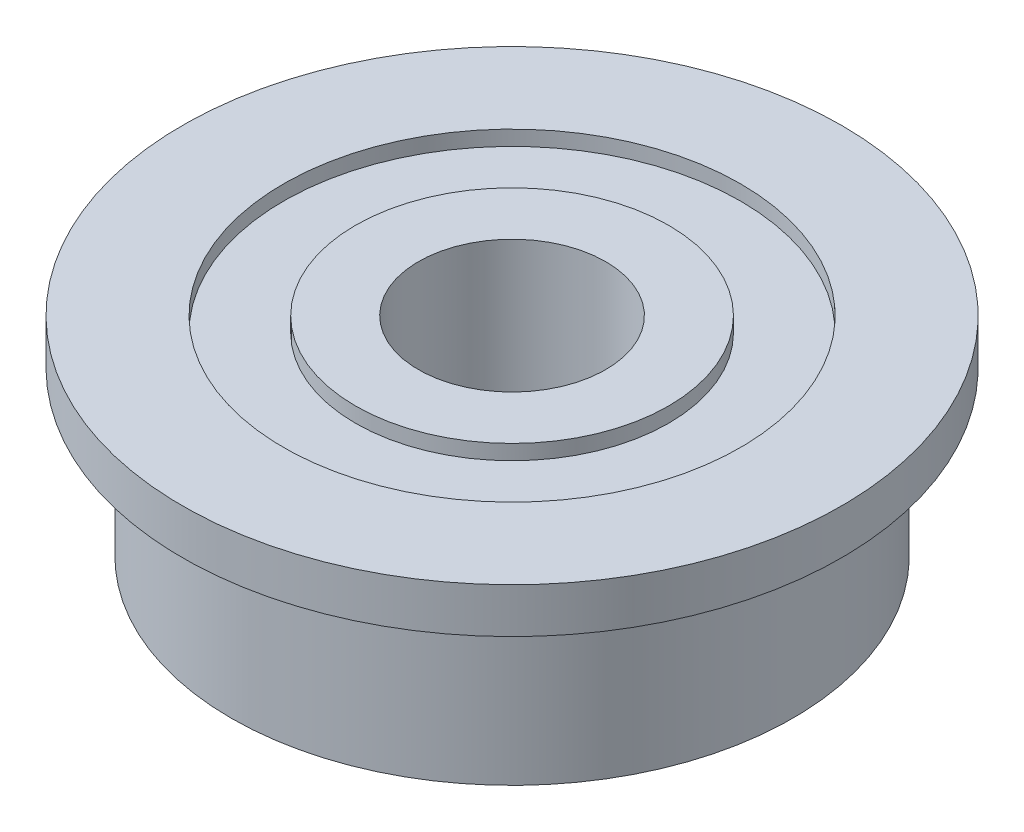
ISO-10303-21;
HEADER;
FILE_DESCRIPTION(('STEP AP214'),'2;1');
FILE_NAME('part.step','',(''),(''),'','','');
FILE_SCHEMA(('AUTOMOTIVE_DESIGN { 1 0 10303 214 1 1 1 1 }'));
ENDSEC;
DATA;
#1=APPLICATION_CONTEXT('core data for automotive mechanical design processes');
#2=APPLICATION_PROTOCOL_DEFINITION('international standard','automotive_design',2000,#1);
#3=PRODUCT_CONTEXT('',#1,'mechanical');
#4=PRODUCT('Part','Part','',(#3));
#5=PRODUCT_RELATED_PRODUCT_CATEGORY('part','',(#4));
#6=PRODUCT_DEFINITION_FORMATION('','',#4);
#7=PRODUCT_DEFINITION_CONTEXT('part definition',#1,'design');
#8=PRODUCT_DEFINITION('design','',#6,#7);
#9=PRODUCT_DEFINITION_SHAPE('','',#8);
#10=(LENGTH_UNIT() NAMED_UNIT(*) SI_UNIT(.MILLI.,.METRE.));
#11=(NAMED_UNIT(*) PLANE_ANGLE_UNIT() SI_UNIT($,.RADIAN.));
#12=(NAMED_UNIT(*) SI_UNIT($,.STERADIAN.) SOLID_ANGLE_UNIT());
#13=UNCERTAINTY_MEASURE_WITH_UNIT(LENGTH_MEASURE(1.E-05),#10,'distance_accuracy_value','');
#14=(GEOMETRIC_REPRESENTATION_CONTEXT(3) GLOBAL_UNCERTAINTY_ASSIGNED_CONTEXT((#13)) GLOBAL_UNIT_ASSIGNED_CONTEXT((#10,
#11,#12)) REPRESENTATION_CONTEXT('',''));
#15=CARTESIAN_POINT('',(0.,0.,0.));
#16=DIRECTION('',(0.,0.,1.));
#17=DIRECTION('',(1.,0.,0.));
#18=AXIS2_PLACEMENT_3D('',#15,#16,#17);
#19=CARTESIAN_POINT('',(1.5875,0.,0.));
#20=DIRECTION('',(0.,-1.,0.));
#21=DIRECTION('',(0.,0.,-1.));
#22=AXIS2_PLACEMENT_3D('',#19,#20,#21);
#23=PLANE('',#22);
#24=CARTESIAN_POINT('',(0.,0.,0.));
#25=DIRECTION('',(0.,-1.,0.));
#26=DIRECTION('',(0.,0.,-1.));
#27=AXIS2_PLACEMENT_3D('',#24,#25,#26);
#28=CIRCLE('',#27,2.6543);
#29=CARTESIAN_POINT('',(0.,0.,-2.6543));
#30=VERTEX_POINT('',#29);
#31=EDGE_CURVE('E10',#30,#30,#28,.T.);
#32=ORIENTED_EDGE('',*,*,#31,.T.);
#33=EDGE_LOOP('',(#32));
#34=FACE_BOUND('',#33,.T.);
#35=CARTESIAN_POINT('',(0.,0.,0.));
#36=DIRECTION('',(0.,-1.,0.));
#37=DIRECTION('',(0.,0.,-1.));
#38=AXIS2_PLACEMENT_3D('',#35,#36,#37);
#39=CIRCLE('',#38,1.5875);
#40=CARTESIAN_POINT('',(0.,0.,-1.5875));
#41=VERTEX_POINT('',#40);
#42=EDGE_CURVE('E76',#41,#41,#39,.T.);
#43=ORIENTED_EDGE('',*,*,#42,.F.);
#44=EDGE_LOOP('',(#43));
#45=FACE_BOUND('',#44,.T.);
#46=ADVANCED_FACE('F30',(#34,#45),#23,.T.);
#47=CARTESIAN_POINT('',(0.,3.5306,0.));
#48=DIRECTION('',(0.,-1.,0.));
#49=DIRECTION('',(0.,0.,-1.));
#50=AXIS2_PLACEMENT_3D('',#47,#48,#49);
#51=CYLINDRICAL_SURFACE('',#50,2.6543);
#52=CARTESIAN_POINT('',(0.,0.254,0.));
#53=DIRECTION('',(0.,-1.,0.));
#54=DIRECTION('',(0.,0.,-1.));
#55=AXIS2_PLACEMENT_3D('',#52,#53,#54);
#56=CIRCLE('',#55,2.6543);
#57=CARTESIAN_POINT('',(0.,0.254,-2.6543));
#58=VERTEX_POINT('',#57);
#59=EDGE_CURVE('E36',#58,#58,#56,.T.);
#60=ORIENTED_EDGE('',*,*,#59,.T.);
#61=EDGE_LOOP('',(#60));
#62=FACE_BOUND('',#61,.T.);
#63=ORIENTED_EDGE('',*,*,#31,.F.);
#64=EDGE_LOOP('',(#63));
#65=FACE_BOUND('',#64,.T.);
#66=ADVANCED_FACE('F84',(#62,#65),#51,.T.);
#67=CARTESIAN_POINT('',(2.6543,0.254,0.));
#68=DIRECTION('',(0.,-1.,0.));
#69=DIRECTION('',(0.,0.,-1.));
#70=AXIS2_PLACEMENT_3D('',#67,#68,#69);
#71=PLANE('',#70);
#72=CARTESIAN_POINT('',(0.,0.254,0.));
#73=DIRECTION('',(0.,-1.,0.));
#74=DIRECTION('',(0.,0.,-1.));
#75=AXIS2_PLACEMENT_3D('',#72,#73,#74);
#76=CIRCLE('',#75,3.8735);
#77=CARTESIAN_POINT('',(0.,0.254,-3.8735));
#78=VERTEX_POINT('',#77);
#79=EDGE_CURVE('E40',#78,#78,#76,.T.);
#80=ORIENTED_EDGE('',*,*,#79,.T.);
#81=EDGE_LOOP('',(#80));
#82=FACE_BOUND('',#81,.T.);
#83=ORIENTED_EDGE('',*,*,#59,.F.);
#84=EDGE_LOOP('',(#83));
#85=FACE_BOUND('',#84,.T.);
#86=ADVANCED_FACE('F88',(#82,#85),#71,.T.);
#87=CARTESIAN_POINT('',(0.,3.5306,0.));
#88=DIRECTION('',(0.,-1.,0.));
#89=DIRECTION('',(0.,0.,-1.));
#90=AXIS2_PLACEMENT_3D('',#87,#88,#89);
#91=CYLINDRICAL_SURFACE('',#90,3.8735);
#92=CARTESIAN_POINT('',(0.,0.,0.));
#93=DIRECTION('',(0.,-1.,0.));
#94=DIRECTION('',(0.,0.,-1.));
#95=AXIS2_PLACEMENT_3D('',#92,#93,#94);
#96=CIRCLE('',#95,3.8735);
#97=CARTESIAN_POINT('',(0.,0.,-3.8735));
#98=VERTEX_POINT('',#97);
#99=EDGE_CURVE('E44',#98,#98,#96,.T.);
#100=ORIENTED_EDGE('',*,*,#99,.T.);
#101=EDGE_LOOP('',(#100));
#102=FACE_BOUND('',#101,.T.);
#103=ORIENTED_EDGE('',*,*,#79,.F.);
#104=EDGE_LOOP('',(#103));
#105=FACE_BOUND('',#104,.T.);
#106=ADVANCED_FACE('F92',(#102,#105),#91,.F.);
#107=CARTESIAN_POINT('',(3.8735,0.,0.));
#108=DIRECTION('',(0.,-1.,0.));
#109=DIRECTION('',(0.,0.,-1.));
#110=AXIS2_PLACEMENT_3D('',#107,#108,#109);
#111=PLANE('',#110);
#112=CARTESIAN_POINT('',(0.,0.,0.));
#113=DIRECTION('',(0.,-1.,0.));
#114=DIRECTION('',(0.,0.,-1.));
#115=AXIS2_PLACEMENT_3D('',#112,#113,#114);
#116=CIRCLE('',#115,4.7625);
#117=CARTESIAN_POINT('',(0.,0.,-4.7625));
#118=VERTEX_POINT('',#117);
#119=EDGE_CURVE('E49',#118,#118,#116,.T.);
#120=ORIENTED_EDGE('',*,*,#119,.T.);
#121=EDGE_LOOP('',(#120));
#122=FACE_BOUND('',#121,.T.);
#123=ORIENTED_EDGE('',*,*,#99,.F.);
#124=EDGE_LOOP('',(#123));
#125=FACE_BOUND('',#124,.T.);
#126=ADVANCED_FACE('F99',(#122,#125),#111,.T.);
#127=CARTESIAN_POINT('',(0.,3.5306,0.));
#128=DIRECTION('',(0.,-1.,0.));
#129=DIRECTION('',(0.,0.,-1.));
#130=AXIS2_PLACEMENT_3D('',#127,#128,#129);
#131=CYLINDRICAL_SURFACE('',#130,4.7625);
#132=CARTESIAN_POINT('',(0.,2.7686,0.));
#133=DIRECTION('',(0.,-1.,0.));
#134=DIRECTION('',(0.,0.,-1.));
#135=AXIS2_PLACEMENT_3D('',#132,#133,#134);
#136=CIRCLE('',#135,4.7625);
#137=CARTESIAN_POINT('',(0.,2.7686,-4.7625));
#138=VERTEX_POINT('',#137);
#139=EDGE_CURVE('E52',#138,#138,#136,.T.);
#140=ORIENTED_EDGE('',*,*,#139,.T.);
#141=EDGE_LOOP('',(#140));
#142=FACE_BOUND('',#141,.T.);
#143=ORIENTED_EDGE('',*,*,#119,.F.);
#144=EDGE_LOOP('',(#143));
#145=FACE_BOUND('',#144,.T.);
#146=ADVANCED_FACE('F103',(#142,#145),#131,.T.);
#147=CARTESIAN_POINT('',(4.7625,2.7686,0.));
#148=DIRECTION('',(0.,-1.,0.));
#149=DIRECTION('',(0.,0.,-1.));
#150=AXIS2_PLACEMENT_3D('',#147,#148,#149);
#151=PLANE('',#150);
#152=CARTESIAN_POINT('',(0.,2.7686,0.));
#153=DIRECTION('',(0.,-1.,0.));
#154=DIRECTION('',(0.,0.,-1.));
#155=AXIS2_PLACEMENT_3D('',#152,#153,#154);
#156=CIRCLE('',#155,5.588);
#157=CARTESIAN_POINT('',(0.,2.7686,-5.588));
#158=VERTEX_POINT('',#157);
#159=EDGE_CURVE('E55',#158,#158,#156,.T.);
#160=ORIENTED_EDGE('',*,*,#159,.T.);
#161=EDGE_LOOP('',(#160));
#162=FACE_BOUND('',#161,.T.);
#163=ORIENTED_EDGE('',*,*,#139,.F.);
#164=EDGE_LOOP('',(#163));
#165=FACE_BOUND('',#164,.T.);
#166=ADVANCED_FACE('F107',(#162,#165),#151,.T.);
#167=CARTESIAN_POINT('',(0.,3.5306,0.));
#168=DIRECTION('',(0.,-1.,0.));
#169=DIRECTION('',(0.,0.,-1.));
#170=AXIS2_PLACEMENT_3D('',#167,#168,#169);
#171=CYLINDRICAL_SURFACE('',#170,5.588);
#172=CARTESIAN_POINT('',(0.,3.5306,0.));
#173=DIRECTION('',(0.,-1.,0.));
#174=DIRECTION('',(0.,0.,-1.));
#175=AXIS2_PLACEMENT_3D('',#172,#173,#174);
#176=CIRCLE('',#175,5.588);
#177=CARTESIAN_POINT('',(0.,3.5306,-5.588));
#178=VERTEX_POINT('',#177);
#179=EDGE_CURVE('E58',#178,#178,#176,.T.);
#180=ORIENTED_EDGE('',*,*,#179,.T.);
#181=EDGE_LOOP('',(#180));
#182=FACE_BOUND('',#181,.T.);
#183=ORIENTED_EDGE('',*,*,#159,.F.);
#184=EDGE_LOOP('',(#183));
#185=FACE_BOUND('',#184,.T.);
#186=ADVANCED_FACE('F111',(#182,#185),#171,.T.);
#187=CARTESIAN_POINT('',(5.588,3.5306,0.));
#188=DIRECTION('',(0.,1.,0.));
#189=DIRECTION('',(0.,0.,1.));
#190=AXIS2_PLACEMENT_3D('',#187,#188,#189);
#191=PLANE('',#190);
#192=CARTESIAN_POINT('',(0.,3.5306,0.));
#193=DIRECTION('',(0.,-1.,0.));
#194=DIRECTION('',(0.,0.,-1.));
#195=AXIS2_PLACEMENT_3D('',#192,#193,#194);
#196=CIRCLE('',#195,3.8735);
#197=CARTESIAN_POINT('',(0.,3.5306,-3.8735));
#198=VERTEX_POINT('',#197);
#199=EDGE_CURVE('E61',#198,#198,#196,.T.);
#200=ORIENTED_EDGE('',*,*,#199,.T.);
#201=EDGE_LOOP('',(#200));
#202=FACE_BOUND('',#201,.T.);
#203=ORIENTED_EDGE('',*,*,#179,.F.);
#204=EDGE_LOOP('',(#203));
#205=FACE_BOUND('',#204,.T.);
#206=ADVANCED_FACE('F115',(#202,#205),#191,.T.);
#207=CARTESIAN_POINT('',(0.,3.5306,0.));
#208=DIRECTION('',(0.,-1.,0.));
#209=DIRECTION('',(0.,0.,-1.));
#210=AXIS2_PLACEMENT_3D('',#207,#208,#209);
#211=CYLINDRICAL_SURFACE('',#210,3.8735);
#212=CARTESIAN_POINT('',(0.,3.2766,0.));
#213=DIRECTION('',(0.,-1.,0.));
#214=DIRECTION('',(0.,0.,-1.));
#215=AXIS2_PLACEMENT_3D('',#212,#213,#214);
#216=CIRCLE('',#215,3.8735);
#217=CARTESIAN_POINT('',(0.,3.2766,-3.8735));
#218=VERTEX_POINT('',#217);
#219=EDGE_CURVE('E64',#218,#218,#216,.T.);
#220=ORIENTED_EDGE('',*,*,#219,.T.);
#221=EDGE_LOOP('',(#220));
#222=FACE_BOUND('',#221,.T.);
#223=ORIENTED_EDGE('',*,*,#199,.F.);
#224=EDGE_LOOP('',(#223));
#225=FACE_BOUND('',#224,.T.);
#226=ADVANCED_FACE('F119',(#222,#225),#211,.F.);
#227=CARTESIAN_POINT('',(3.8735,3.2766,0.));
#228=DIRECTION('',(0.,1.,0.));
#229=DIRECTION('',(0.,0.,1.));
#230=AXIS2_PLACEMENT_3D('',#227,#228,#229);
#231=PLANE('',#230);
#232=CARTESIAN_POINT('',(0.,3.2766,0.));
#233=DIRECTION('',(0.,-1.,0.));
#234=DIRECTION('',(0.,0.,-1.));
#235=AXIS2_PLACEMENT_3D('',#232,#233,#234);
#236=CIRCLE('',#235,2.6543);
#237=CARTESIAN_POINT('',(0.,3.2766,-2.6543));
#238=VERTEX_POINT('',#237);
#239=EDGE_CURVE('E67',#238,#238,#236,.T.);
#240=ORIENTED_EDGE('',*,*,#239,.T.);
#241=EDGE_LOOP('',(#240));
#242=FACE_BOUND('',#241,.T.);
#243=ORIENTED_EDGE('',*,*,#219,.F.);
#244=EDGE_LOOP('',(#243));
#245=FACE_BOUND('',#244,.T.);
#246=ADVANCED_FACE('F123',(#242,#245),#231,.T.);
#247=CARTESIAN_POINT('',(0.,3.5306,0.));
#248=DIRECTION('',(0.,-1.,0.));
#249=DIRECTION('',(0.,0.,-1.));
#250=AXIS2_PLACEMENT_3D('',#247,#248,#249);
#251=CYLINDRICAL_SURFACE('',#250,2.6543);
#252=CARTESIAN_POINT('',(0.,3.5306,0.));
#253=DIRECTION('',(0.,-1.,0.));
#254=DIRECTION('',(0.,0.,-1.));
#255=AXIS2_PLACEMENT_3D('',#252,#253,#254);
#256=CIRCLE('',#255,2.6543);
#257=CARTESIAN_POINT('',(0.,3.5306,-2.6543));
#258=VERTEX_POINT('',#257);
#259=EDGE_CURVE('E70',#258,#258,#256,.T.);
#260=ORIENTED_EDGE('',*,*,#259,.T.);
#261=EDGE_LOOP('',(#260));
#262=FACE_BOUND('',#261,.T.);
#263=ORIENTED_EDGE('',*,*,#239,.F.);
#264=EDGE_LOOP('',(#263));
#265=FACE_BOUND('',#264,.T.);
#266=ADVANCED_FACE('F127',(#262,#265),#251,.T.);
#267=CARTESIAN_POINT('',(2.6543,3.5306,0.));
#268=DIRECTION('',(0.,1.,0.));
#269=DIRECTION('',(0.,0.,1.));
#270=AXIS2_PLACEMENT_3D('',#267,#268,#269);
#271=PLANE('',#270);
#272=CARTESIAN_POINT('',(0.,3.5306,0.));
#273=DIRECTION('',(0.,-1.,0.));
#274=DIRECTION('',(0.,0.,-1.));
#275=AXIS2_PLACEMENT_3D('',#272,#273,#274);
#276=CIRCLE('',#275,1.5875);
#277=CARTESIAN_POINT('',(0.,3.5306,-1.5875));
#278=VERTEX_POINT('',#277);
#279=EDGE_CURVE('E73',#278,#278,#276,.T.);
#280=ORIENTED_EDGE('',*,*,#279,.T.);
#281=EDGE_LOOP('',(#280));
#282=FACE_BOUND('',#281,.T.);
#283=ORIENTED_EDGE('',*,*,#259,.F.);
#284=EDGE_LOOP('',(#283));
#285=FACE_BOUND('',#284,.T.);
#286=ADVANCED_FACE('F131',(#282,#285),#271,.T.);
#287=CARTESIAN_POINT('',(0.,3.5306,0.));
#288=DIRECTION('',(0.,-1.,0.));
#289=DIRECTION('',(0.,0.,-1.));
#290=AXIS2_PLACEMENT_3D('',#287,#288,#289);
#291=CYLINDRICAL_SURFACE('',#290,1.5875);
#292=ORIENTED_EDGE('',*,*,#42,.T.);
#293=EDGE_LOOP('',(#292));
#294=FACE_BOUND('',#293,.T.);
#295=ORIENTED_EDGE('',*,*,#279,.F.);
#296=EDGE_LOOP('',(#295));
#297=FACE_BOUND('',#296,.T.);
#298=ADVANCED_FACE('F80',(#294,#297),#291,.F.);
#299=CLOSED_SHELL('',(#46,#66,#86,#106,#126,#146,#166,#186,#206,#226,#246,#266,#286,#298));
#300=MANIFOLD_SOLID_BREP('B2',#299);
#301=ADVANCED_BREP_SHAPE_REPRESENTATION('',(#18,#300),#14);
#302=SHAPE_DEFINITION_REPRESENTATION(#9,#301);
ENDSEC;
END-ISO-10303-21;
